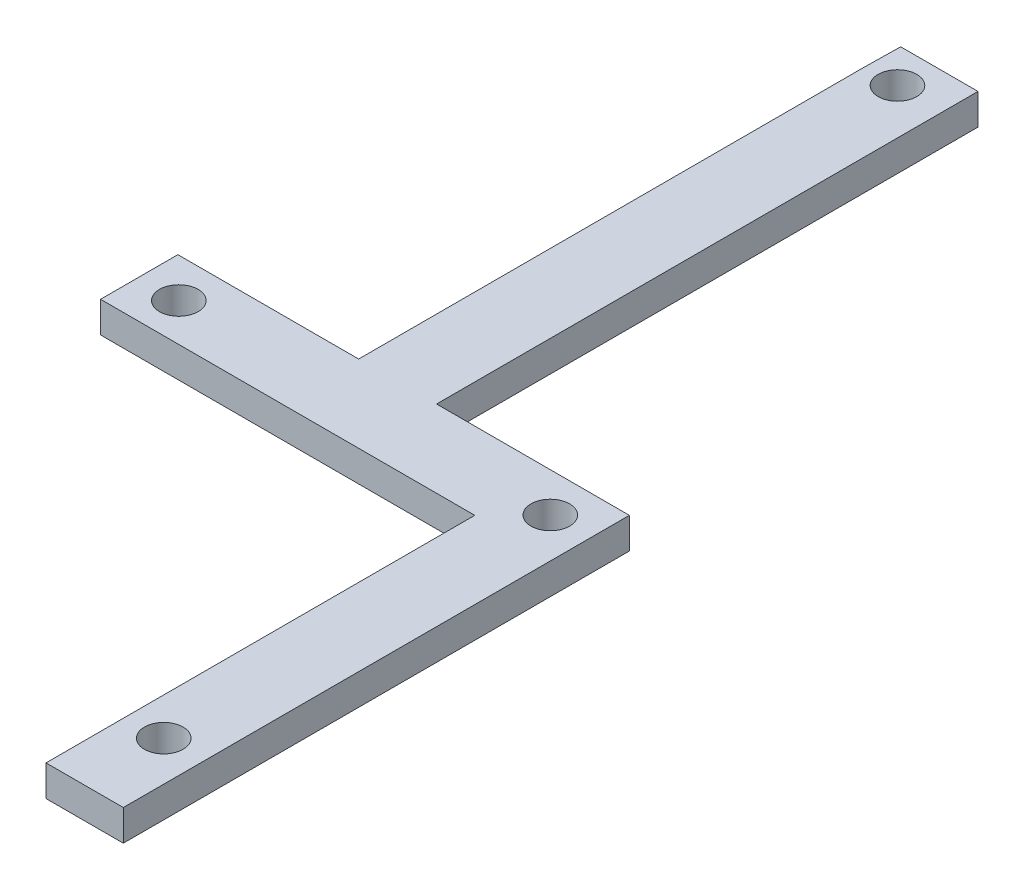
ISO-10303-21;
HEADER;
FILE_DESCRIPTION(('STEP AP214'),'2;1');
FILE_NAME('part.step','',(''),(''),'','','');
FILE_SCHEMA(('AUTOMOTIVE_DESIGN { 1 0 10303 214 1 1 1 1 }'));
ENDSEC;
DATA;
#1=APPLICATION_CONTEXT('core data for automotive mechanical design processes');
#2=APPLICATION_PROTOCOL_DEFINITION('international standard','automotive_design',2000,#1);
#3=PRODUCT_CONTEXT('',#1,'mechanical');
#4=PRODUCT('Part','Part','',(#3));
#5=PRODUCT_RELATED_PRODUCT_CATEGORY('part','',(#4));
#6=PRODUCT_DEFINITION_FORMATION('','',#4);
#7=PRODUCT_DEFINITION_CONTEXT('part definition',#1,'design');
#8=PRODUCT_DEFINITION('design','',#6,#7);
#9=PRODUCT_DEFINITION_SHAPE('','',#8);
#10=(LENGTH_UNIT() NAMED_UNIT(*) SI_UNIT(.MILLI.,.METRE.));
#11=(NAMED_UNIT(*) PLANE_ANGLE_UNIT() SI_UNIT($,.RADIAN.));
#12=(NAMED_UNIT(*) SI_UNIT($,.STERADIAN.) SOLID_ANGLE_UNIT());
#13=UNCERTAINTY_MEASURE_WITH_UNIT(LENGTH_MEASURE(1.E-05),#10,'distance_accuracy_value','');
#14=(GEOMETRIC_REPRESENTATION_CONTEXT(3) GLOBAL_UNCERTAINTY_ASSIGNED_CONTEXT((#13)) GLOBAL_UNIT_ASSIGNED_CONTEXT((#10,
#11,#12)) REPRESENTATION_CONTEXT('',''));
#15=CARTESIAN_POINT('',(0.,0.,0.));
#16=DIRECTION('',(0.,0.,1.));
#17=DIRECTION('',(1.,0.,0.));
#18=AXIS2_PLACEMENT_3D('',#15,#16,#17);
#19=CARTESIAN_POINT('',(3.36246655708464,2.,-2.07431627350034));
#20=DIRECTION('',(0.,0.,-1.));
#21=DIRECTION('',(-1.,0.,0.));
#22=AXIS2_PLACEMENT_3D('',#19,#20,#21);
#23=PLANE('',#22);
#24=DIRECTION('',(1.,0.,0.));
#25=VECTOR('',#24,1.);
#26=CARTESIAN_POINT('',(3.36246655708464,0.,-2.07431627350034));
#27=LINE('',#26,#25);
#28=CARTESIAN_POINT('',(3.36246655708464,0.,-2.07431627350034));
#29=VERTEX_POINT('',#28);
#30=CARTESIAN_POINT('',(27.5653854251472,0.,-2.07431627350034));
#31=VERTEX_POINT('',#30);
#32=EDGE_CURVE('E157',#29,#31,#27,.T.);
#33=ORIENTED_EDGE('',*,*,#32,.T.);
#34=DIRECTION('',(0.,-1.,0.));
#35=VECTOR('',#34,1.);
#36=CARTESIAN_POINT('',(27.5653854251472,2.,-2.07431627350034));
#37=LINE('',#36,#35);
#38=CARTESIAN_POINT('',(27.5653854251472,2.,-2.07431627350034));
#39=VERTEX_POINT('',#38);
#40=EDGE_CURVE('E11',#39,#31,#37,.T.);
#41=ORIENTED_EDGE('',*,*,#40,.F.);
#42=DIRECTION('',(1.,0.,0.));
#43=VECTOR('',#42,1.);
#44=CARTESIAN_POINT('',(3.36246655708464,2.,-2.07431627350034));
#45=LINE('',#44,#43);
#46=CARTESIAN_POINT('',(3.36246655708464,2.,-2.07431627350034));
#47=VERTEX_POINT('',#46);
#48=EDGE_CURVE('E190',#47,#39,#45,.T.);
#49=ORIENTED_EDGE('',*,*,#48,.F.);
#50=DIRECTION('',(0.,-1.,0.));
#51=VECTOR('',#50,1.);
#52=CARTESIAN_POINT('',(3.36246655708464,2.,-2.07431627350034));
#53=LINE('',#52,#51);
#54=EDGE_CURVE('E153',#47,#29,#53,.T.);
#55=ORIENTED_EDGE('',*,*,#54,.T.);
#56=EDGE_LOOP('',(#33,#41,#49,#55));
#57=FACE_BOUND('',#56,.T.);
#58=ADVANCED_FACE('F39',(#57),#23,.F.);
#59=CARTESIAN_POINT('',(27.5653854251472,2.,-2.07431627350034));
#60=DIRECTION('',(1.,0.,0.));
#61=DIRECTION('',(0.,0.,-1.));
#62=AXIS2_PLACEMENT_3D('',#59,#60,#61);
#63=PLANE('',#62);
#64=DIRECTION('',(0.,0.,1.));
#65=VECTOR('',#64,1.);
#66=CARTESIAN_POINT('',(27.5653854251472,0.,-2.07431627350034));
#67=LINE('',#66,#65);
#68=CARTESIAN_POINT('',(27.5653854251472,0.,25.6572654948525));
#69=VERTEX_POINT('',#68);
#70=EDGE_CURVE('E161',#31,#69,#67,.T.);
#71=ORIENTED_EDGE('',*,*,#70,.T.);
#72=DIRECTION('',(0.,-1.,0.));
#73=VECTOR('',#72,1.);
#74=CARTESIAN_POINT('',(27.5653854251472,2.,25.6572654948525));
#75=LINE('',#74,#73);
#76=CARTESIAN_POINT('',(27.5653854251472,2.,25.6572654948525));
#77=VERTEX_POINT('',#76);
#78=EDGE_CURVE('E48',#77,#69,#75,.T.);
#79=ORIENTED_EDGE('',*,*,#78,.F.);
#80=DIRECTION('',(0.,0.,1.));
#81=VECTOR('',#80,1.);
#82=CARTESIAN_POINT('',(27.5653854251472,2.,-2.07431627350034));
#83=LINE('',#82,#81);
#84=EDGE_CURVE('E108',#39,#77,#83,.T.);
#85=ORIENTED_EDGE('',*,*,#84,.F.);
#86=ORIENTED_EDGE('',*,*,#40,.T.);
#87=EDGE_LOOP('',(#71,#79,#85,#86));
#88=FACE_BOUND('',#87,.T.);
#89=ADVANCED_FACE('F277',(#88),#63,.F.);
#90=CARTESIAN_POINT('',(27.5653854251472,2.,25.6572654948525));
#91=DIRECTION('',(0.,0.,-1.));
#92=DIRECTION('',(-1.,0.,0.));
#93=AXIS2_PLACEMENT_3D('',#90,#91,#92);
#94=PLANE('',#93);
#95=DIRECTION('',(1.,0.,0.));
#96=VECTOR('',#95,1.);
#97=CARTESIAN_POINT('',(27.5653854251472,0.,25.6572654948525));
#98=LINE('',#97,#96);
#99=CARTESIAN_POINT('',(32.5653854251472,0.,25.6572654948525));
#100=VERTEX_POINT('',#99);
#101=EDGE_CURVE('E165',#69,#100,#98,.T.);
#102=ORIENTED_EDGE('',*,*,#101,.T.);
#103=DIRECTION('',(0.,-1.,0.));
#104=VECTOR('',#103,1.);
#105=CARTESIAN_POINT('',(32.5653854251472,2.,25.6572654948525));
#106=LINE('',#105,#104);
#107=CARTESIAN_POINT('',(32.5653854251472,2.,25.6572654948525));
#108=VERTEX_POINT('',#107);
#109=EDGE_CURVE('E213',#108,#100,#106,.T.);
#110=ORIENTED_EDGE('',*,*,#109,.F.);
#111=DIRECTION('',(1.,0.,0.));
#112=VECTOR('',#111,1.);
#113=CARTESIAN_POINT('',(27.5653854251472,2.,25.6572654948525));
#114=LINE('',#113,#112);
#115=EDGE_CURVE('E223',#77,#108,#114,.T.);
#116=ORIENTED_EDGE('',*,*,#115,.F.);
#117=ORIENTED_EDGE('',*,*,#78,.T.);
#118=EDGE_LOOP('',(#102,#110,#116,#117));
#119=FACE_BOUND('',#118,.T.);
#120=ADVANCED_FACE('F221',(#119),#94,.F.);
#121=CARTESIAN_POINT('',(32.5653854251472,2.,25.6572654948525));
#122=DIRECTION('',(-1.,0.,0.));
#123=DIRECTION('',(0.,0.,1.));
#124=AXIS2_PLACEMENT_3D('',#121,#122,#123);
#125=PLANE('',#124);
#126=DIRECTION('',(0.,0.,-1.));
#127=VECTOR('',#126,1.);
#128=CARTESIAN_POINT('',(32.5653854251472,0.,25.6572654948525));
#129=LINE('',#128,#127);
#130=CARTESIAN_POINT('',(32.5653854251472,0.,-7.07431627350035));
#131=VERTEX_POINT('',#130);
#132=EDGE_CURVE('E168',#100,#131,#129,.T.);
#133=ORIENTED_EDGE('',*,*,#132,.T.);
#134=DIRECTION('',(0.,-1.,0.));
#135=VECTOR('',#134,1.);
#136=CARTESIAN_POINT('',(32.5653854251472,2.,-7.07431627350035));
#137=LINE('',#136,#135);
#138=CARTESIAN_POINT('',(32.5653854251472,2.,-7.07431627350035));
#139=VERTEX_POINT('',#138);
#140=EDGE_CURVE('E209',#139,#131,#137,.T.);
#141=ORIENTED_EDGE('',*,*,#140,.F.);
#142=DIRECTION('',(0.,0.,-1.));
#143=VECTOR('',#142,1.);
#144=CARTESIAN_POINT('',(32.5653854251472,2.,25.6572654948525));
#145=LINE('',#144,#143);
#146=EDGE_CURVE('E242',#108,#139,#145,.T.);
#147=ORIENTED_EDGE('',*,*,#146,.F.);
#148=ORIENTED_EDGE('',*,*,#109,.T.);
#149=EDGE_LOOP('',(#133,#141,#147,#148));
#150=FACE_BOUND('',#149,.T.);
#151=ADVANCED_FACE('F232',(#150),#125,.F.);
#152=CARTESIAN_POINT('',(32.5653854251472,2.,-7.07431627350035));
#153=DIRECTION('',(0.,0.,1.));
#154=DIRECTION('',(1.,0.,0.));
#155=AXIS2_PLACEMENT_3D('',#152,#153,#154);
#156=PLANE('',#155);
#157=DIRECTION('',(-1.,0.,0.));
#158=VECTOR('',#157,1.);
#159=CARTESIAN_POINT('',(32.5653854251472,0.,-7.07431627350035));
#160=LINE('',#159,#158);
#161=CARTESIAN_POINT('',(20.0947999918388,0.,-7.07431627350035));
#162=VERTEX_POINT('',#161);
#163=EDGE_CURVE('E171',#131,#162,#160,.T.);
#164=ORIENTED_EDGE('',*,*,#163,.T.);
#165=DIRECTION('',(0.,-1.,0.));
#166=VECTOR('',#165,1.);
#167=CARTESIAN_POINT('',(20.0947999918388,2.,-7.07431627350035));
#168=LINE('',#167,#166);
#169=CARTESIAN_POINT('',(20.0947999918388,2.,-7.07431627350035));
#170=VERTEX_POINT('',#169);
#171=EDGE_CURVE('E205',#170,#162,#168,.T.);
#172=ORIENTED_EDGE('',*,*,#171,.F.);
#173=DIRECTION('',(-1.,0.,0.));
#174=VECTOR('',#173,1.);
#175=CARTESIAN_POINT('',(32.5653854251472,2.,-7.07431627350035));
#176=LINE('',#175,#174);
#177=EDGE_CURVE('E238',#139,#170,#176,.T.);
#178=ORIENTED_EDGE('',*,*,#177,.F.);
#179=ORIENTED_EDGE('',*,*,#140,.T.);
#180=EDGE_LOOP('',(#164,#172,#178,#179));
#181=FACE_BOUND('',#180,.T.);
#182=ADVANCED_FACE('F236',(#181),#156,.F.);
#183=CARTESIAN_POINT('',(20.0947999918388,2.,-7.07431627350035));
#184=DIRECTION('',(-1.,0.,0.));
#185=DIRECTION('',(0.,0.,1.));
#186=AXIS2_PLACEMENT_3D('',#183,#184,#185);
#187=PLANE('',#186);
#188=DIRECTION('',(0.,0.,-1.));
#189=VECTOR('',#188,1.);
#190=CARTESIAN_POINT('',(20.0947999918388,0.,-7.07431627350035));
#191=LINE('',#190,#189);
#192=CARTESIAN_POINT('',(20.0947999918388,0.,-42.0922483664968));
#193=VERTEX_POINT('',#192);
#194=EDGE_CURVE('E174',#162,#193,#191,.T.);
#195=ORIENTED_EDGE('',*,*,#194,.T.);
#196=DIRECTION('',(0.,-1.,0.));
#197=VECTOR('',#196,1.);
#198=CARTESIAN_POINT('',(20.0947999918388,2.,-42.0922483664968));
#199=LINE('',#198,#197);
#200=CARTESIAN_POINT('',(20.0947999918388,2.,-42.0922483664968));
#201=VERTEX_POINT('',#200);
#202=EDGE_CURVE('E201',#201,#193,#199,.T.);
#203=ORIENTED_EDGE('',*,*,#202,.F.);
#204=DIRECTION('',(0.,0.,-1.));
#205=VECTOR('',#204,1.);
#206=CARTESIAN_POINT('',(20.0947999918388,2.,-7.07431627350035));
#207=LINE('',#206,#205);
#208=EDGE_CURVE('E241',#170,#201,#207,.T.);
#209=ORIENTED_EDGE('',*,*,#208,.F.);
#210=ORIENTED_EDGE('',*,*,#171,.T.);
#211=EDGE_LOOP('',(#195,#203,#209,#210));
#212=FACE_BOUND('',#211,.T.);
#213=ADVANCED_FACE('F290',(#212),#187,.F.);
#214=CARTESIAN_POINT('',(20.0947999918388,2.,-42.0922483664968));
#215=DIRECTION('',(0.,0.,1.));
#216=DIRECTION('',(1.,0.,0.));
#217=AXIS2_PLACEMENT_3D('',#214,#215,#216);
#218=PLANE('',#217);
#219=DIRECTION('',(-1.,0.,0.));
#220=VECTOR('',#219,1.);
#221=CARTESIAN_POINT('',(20.0947999918388,0.,-42.0922483664968));
#222=LINE('',#221,#220);
#223=CARTESIAN_POINT('',(15.0947999918388,0.,-42.0922483664968));
#224=VERTEX_POINT('',#223);
#225=EDGE_CURVE('E177',#193,#224,#222,.T.);
#226=ORIENTED_EDGE('',*,*,#225,.T.);
#227=DIRECTION('',(0.,-1.,0.));
#228=VECTOR('',#227,1.);
#229=CARTESIAN_POINT('',(15.0947999918388,2.,-42.0922483664968));
#230=LINE('',#229,#228);
#231=CARTESIAN_POINT('',(15.0947999918388,2.,-42.0922483664968));
#232=VERTEX_POINT('',#231);
#233=EDGE_CURVE('E197',#232,#224,#230,.T.);
#234=ORIENTED_EDGE('',*,*,#233,.F.);
#235=DIRECTION('',(-1.,0.,0.));
#236=VECTOR('',#235,1.);
#237=CARTESIAN_POINT('',(20.0947999918388,2.,-42.0922483664968));
#238=LINE('',#237,#236);
#239=EDGE_CURVE('E246',#201,#232,#238,.T.);
#240=ORIENTED_EDGE('',*,*,#239,.F.);
#241=ORIENTED_EDGE('',*,*,#202,.T.);
#242=EDGE_LOOP('',(#226,#234,#240,#241));
#243=FACE_BOUND('',#242,.T.);
#244=ADVANCED_FACE('F257',(#243),#218,.F.);
#245=CARTESIAN_POINT('',(15.0947999918388,2.,-42.0922483664968));
#246=DIRECTION('',(0.999868133574607,0.,0.0162393183979964));
#247=DIRECTION('',(0.0162393183979964,0.,-0.999868133574607));
#248=AXIS2_PLACEMENT_3D('',#245,#246,#247);
#249=PLANE('',#248);
#250=DIRECTION('',(-0.0162393183979964,0.,0.999868133574607));
#251=VECTOR('',#250,1.);
#252=CARTESIAN_POINT('',(15.0947999918388,0.,-42.0922483664968));
#253=LINE('',#252,#251);
#254=CARTESIAN_POINT('',(15.0560239070973,0.,-39.7047730718022));
#255=VERTEX_POINT('',#254);
#256=EDGE_CURVE('E180',#224,#255,#253,.T.);
#257=ORIENTED_EDGE('',*,*,#256,.T.);
#258=DIRECTION('',(0.,-1.,0.));
#259=VECTOR('',#258,1.);
#260=CARTESIAN_POINT('',(15.0560239070973,2.,-39.7047730718022));
#261=LINE('',#260,#259);
#262=CARTESIAN_POINT('',(15.0560239070973,2.,-39.7047730718022));
#263=VERTEX_POINT('',#262);
#264=EDGE_CURVE('E146',#263,#255,#261,.T.);
#265=ORIENTED_EDGE('',*,*,#264,.F.);
#266=DIRECTION('',(-0.0162393183979964,0.,0.999868133574607));
#267=VECTOR('',#266,1.);
#268=CARTESIAN_POINT('',(15.0947999918388,2.,-42.0922483664968));
#269=LINE('',#268,#267);
#270=EDGE_CURVE('E136',#232,#263,#269,.T.);
#271=ORIENTED_EDGE('',*,*,#270,.F.);
#272=ORIENTED_EDGE('',*,*,#233,.T.);
#273=EDGE_LOOP('',(#257,#265,#271,#272));
#274=FACE_BOUND('',#273,.T.);
#275=ADVANCED_FACE('F261',(#274),#249,.F.);
#276=CARTESIAN_POINT('',(15.0560239070973,2.,-26.1681876837931));
#277=DIRECTION('',(1.,0.,0.));
#278=DIRECTION('',(0.,0.,-1.));
#279=AXIS2_PLACEMENT_3D('',#276,#277,#278);
#280=PLANE('',#279);
#281=DIRECTION('',(0.,0.,1.));
#282=VECTOR('',#281,1.);
#283=CARTESIAN_POINT('',(15.0560239070973,0.,-26.1681876837931));
#284=LINE('',#283,#282);
#285=CARTESIAN_POINT('',(15.0560239070973,0.,-7.07431627350035));
#286=VERTEX_POINT('',#285);
#287=EDGE_CURVE('E144',#255,#286,#284,.T.);
#288=ORIENTED_EDGE('',*,*,#287,.T.);
#289=DIRECTION('',(0.,-1.,0.));
#290=VECTOR('',#289,1.);
#291=CARTESIAN_POINT('',(15.0560239070973,2.,-7.07431627350035));
#292=LINE('',#291,#290);
#293=CARTESIAN_POINT('',(15.0560239070973,2.,-7.07431627350035));
#294=VERTEX_POINT('',#293);
#295=EDGE_CURVE('E142',#294,#286,#292,.T.);
#296=ORIENTED_EDGE('',*,*,#295,.F.);
#297=DIRECTION('',(0.,0.,1.));
#298=VECTOR('',#297,1.);
#299=CARTESIAN_POINT('',(15.0560239070973,2.,-39.7047730718022));
#300=LINE('',#299,#298);
#301=EDGE_CURVE('E130',#263,#294,#300,.T.);
#302=ORIENTED_EDGE('',*,*,#301,.F.);
#303=ORIENTED_EDGE('',*,*,#264,.T.);
#304=EDGE_LOOP('',(#288,#296,#302,#303));
#305=FACE_BOUND('',#304,.T.);
#306=ADVANCED_FACE('F143',(#305),#280,.F.);
#307=CARTESIAN_POINT('',(15.0560239070973,2.,-7.07431627350035));
#308=DIRECTION('',(0.,0.,1.));
#309=DIRECTION('',(1.,0.,0.));
#310=AXIS2_PLACEMENT_3D('',#307,#308,#309);
#311=PLANE('',#310);
#312=DIRECTION('',(-1.,0.,0.));
#313=VECTOR('',#312,1.);
#314=CARTESIAN_POINT('',(15.0560239070973,0.,-7.07431627350035));
#315=LINE('',#314,#313);
#316=CARTESIAN_POINT('',(3.36246655708464,0.,-7.07431627350034));
#317=VERTEX_POINT('',#316);
#318=EDGE_CURVE('E94',#286,#317,#315,.T.);
#319=ORIENTED_EDGE('',*,*,#318,.T.);
#320=DIRECTION('',(0.,-1.,0.));
#321=VECTOR('',#320,1.);
#322=CARTESIAN_POINT('',(3.36246655708464,2.,-7.07431627350034));
#323=LINE('',#322,#321);
#324=CARTESIAN_POINT('',(3.36246655708464,2.,-7.07431627350034));
#325=VERTEX_POINT('',#324);
#326=EDGE_CURVE('E147',#325,#317,#323,.T.);
#327=ORIENTED_EDGE('',*,*,#326,.F.);
#328=DIRECTION('',(-1.,0.,0.));
#329=VECTOR('',#328,1.);
#330=CARTESIAN_POINT('',(15.0560239070973,2.,-7.07431627350035));
#331=LINE('',#330,#329);
#332=EDGE_CURVE('E134',#294,#325,#331,.T.);
#333=ORIENTED_EDGE('',*,*,#332,.F.);
#334=ORIENTED_EDGE('',*,*,#295,.T.);
#335=EDGE_LOOP('',(#319,#327,#333,#334));
#336=FACE_BOUND('',#335,.T.);
#337=ADVANCED_FACE('F149',(#336),#311,.F.);
#338=CARTESIAN_POINT('',(3.36246655708464,2.,-7.07431627350034));
#339=DIRECTION('',(1.,0.,0.));
#340=DIRECTION('',(0.,0.,-1.));
#341=AXIS2_PLACEMENT_3D('',#338,#339,#340);
#342=PLANE('',#341);
#343=DIRECTION('',(0.,0.,1.));
#344=VECTOR('',#343,1.);
#345=CARTESIAN_POINT('',(3.36246655708464,0.,-7.07431627350034));
#346=LINE('',#345,#344);
#347=EDGE_CURVE('E100',#317,#29,#346,.T.);
#348=ORIENTED_EDGE('',*,*,#347,.T.);
#349=ORIENTED_EDGE('',*,*,#54,.F.);
#350=DIRECTION('',(0.,0.,1.));
#351=VECTOR('',#350,1.);
#352=CARTESIAN_POINT('',(3.36246655708464,2.,-7.07431627350034));
#353=LINE('',#352,#351);
#354=EDGE_CURVE('E56',#325,#47,#353,.T.);
#355=ORIENTED_EDGE('',*,*,#354,.F.);
#356=ORIENTED_EDGE('',*,*,#326,.T.);
#357=EDGE_LOOP('',(#348,#349,#355,#356));
#358=FACE_BOUND('',#357,.T.);
#359=ADVANCED_FACE('F265',(#358),#342,.F.);
#360=CARTESIAN_POINT('',(0.,2.,0.));
#361=DIRECTION('',(0.,-1.,0.));
#362=DIRECTION('',(0.,0.,-1.));
#363=AXIS2_PLACEMENT_3D('',#360,#361,#362);
#364=PLANE('',#363);
#365=CARTESIAN_POINT('',(17.1586532714971,2.,-39.8197879478269));
#366=DIRECTION('',(0.,1.,0.));
#367=DIRECTION('',(0.,0.,1.));
#368=AXIS2_PLACEMENT_3D('',#365,#366,#367);
#369=CIRCLE('',#368,1.25);
#370=CARTESIAN_POINT('',(17.1586532714971,2.,-38.5697879478269));
#371=VERTEX_POINT('',#370);
#372=EDGE_CURVE('E374',#371,#371,#369,.T.);
#373=ORIENTED_EDGE('',*,*,#372,.F.);
#374=EDGE_LOOP('',(#373));
#375=FACE_BOUND('',#374,.T.);
#376=CARTESIAN_POINT('',(5.9622637612266,2.,-4.53578794782702));
#377=DIRECTION('',(0.,1.,0.));
#378=DIRECTION('',(0.,0.,1.));
#379=AXIS2_PLACEMENT_3D('',#376,#377,#378);
#380=CIRCLE('',#379,1.25);
#381=CARTESIAN_POINT('',(5.9622637612266,2.,-3.28578794782702));
#382=VERTEX_POINT('',#381);
#383=EDGE_CURVE('E382',#382,#382,#380,.T.);
#384=ORIENTED_EDGE('',*,*,#383,.F.);
#385=EDGE_LOOP('',(#384));
#386=FACE_BOUND('',#385,.T.);
#387=CARTESIAN_POINT('',(29.9886532714963,2.,-4.53578794782702));
#388=DIRECTION('',(0.,1.,0.));
#389=DIRECTION('',(0.,0.,1.));
#390=AXIS2_PLACEMENT_3D('',#387,#388,#389);
#391=CIRCLE('',#390,1.25);
#392=CARTESIAN_POINT('',(29.9886532714963,2.,-3.28578794782702));
#393=VERTEX_POINT('',#392);
#394=EDGE_CURVE('E392',#393,#393,#391,.T.);
#395=ORIENTED_EDGE('',*,*,#394,.F.);
#396=EDGE_LOOP('',(#395));
#397=FACE_BOUND('',#396,.T.);
#398=CARTESIAN_POINT('',(29.9886532714963,2.,20.4663095498579));
#399=DIRECTION('',(0.,1.,0.));
#400=DIRECTION('',(0.,0.,1.));
#401=AXIS2_PLACEMENT_3D('',#398,#399,#400);
#402=CIRCLE('',#401,1.25);
#403=CARTESIAN_POINT('',(29.9886532714963,2.,21.7163095498579));
#404=VERTEX_POINT('',#403);
#405=EDGE_CURVE('E400',#404,#404,#402,.T.);
#406=ORIENTED_EDGE('',*,*,#405,.F.);
#407=EDGE_LOOP('',(#406));
#408=FACE_BOUND('',#407,.T.);
#409=ORIENTED_EDGE('',*,*,#48,.T.);
#410=ORIENTED_EDGE('',*,*,#84,.T.);
#411=ORIENTED_EDGE('',*,*,#115,.T.);
#412=ORIENTED_EDGE('',*,*,#146,.T.);
#413=ORIENTED_EDGE('',*,*,#177,.T.);
#414=ORIENTED_EDGE('',*,*,#208,.T.);
#415=ORIENTED_EDGE('',*,*,#239,.T.);
#416=ORIENTED_EDGE('',*,*,#270,.T.);
#417=ORIENTED_EDGE('',*,*,#301,.T.);
#418=ORIENTED_EDGE('',*,*,#332,.T.);
#419=ORIENTED_EDGE('',*,*,#354,.T.);
#420=EDGE_LOOP('',(#409,#410,#411,#412,#413,#414,#415,#416,#417,#418,#419));
#421=FACE_BOUND('',#420,.T.);
#422=ADVANCED_FACE('F132',(#375,#386,#397,#408,#421),#364,.F.);
#423=CARTESIAN_POINT('',(0.,0.,0.));
#424=DIRECTION('',(0.,-1.,0.));
#425=DIRECTION('',(0.,0.,-1.));
#426=AXIS2_PLACEMENT_3D('',#423,#424,#425);
#427=PLANE('',#426);
#428=CARTESIAN_POINT('',(17.1586532714971,0.,-39.8197879478269));
#429=DIRECTION('',(0.,1.,0.));
#430=DIRECTION('',(0.,0.,1.));
#431=AXIS2_PLACEMENT_3D('',#428,#429,#430);
#432=CIRCLE('',#431,1.25);
#433=CARTESIAN_POINT('',(17.1586532714971,0.,-38.5697879478269));
#434=VERTEX_POINT('',#433);
#435=EDGE_CURVE('E162',#434,#434,#432,.T.);
#436=ORIENTED_EDGE('',*,*,#435,.T.);
#437=EDGE_LOOP('',(#436));
#438=FACE_BOUND('',#437,.T.);
#439=CARTESIAN_POINT('',(5.9622637612266,0.,-4.53578794782702));
#440=DIRECTION('',(0.,1.,0.));
#441=DIRECTION('',(0.,0.,1.));
#442=AXIS2_PLACEMENT_3D('',#439,#440,#441);
#443=CIRCLE('',#442,1.25);
#444=CARTESIAN_POINT('',(5.9622637612266,0.,-3.28578794782702));
#445=VERTEX_POINT('',#444);
#446=EDGE_CURVE('E376',#445,#445,#443,.T.);
#447=ORIENTED_EDGE('',*,*,#446,.T.);
#448=EDGE_LOOP('',(#447));
#449=FACE_BOUND('',#448,.T.);
#450=CARTESIAN_POINT('',(29.9886532714963,0.,-4.53578794782702));
#451=DIRECTION('',(0.,1.,0.));
#452=DIRECTION('',(0.,0.,1.));
#453=AXIS2_PLACEMENT_3D('',#450,#451,#452);
#454=CIRCLE('',#453,1.25);
#455=CARTESIAN_POINT('',(29.9886532714963,0.,-3.28578794782702));
#456=VERTEX_POINT('',#455);
#457=EDGE_CURVE('E388',#456,#456,#454,.T.);
#458=ORIENTED_EDGE('',*,*,#457,.T.);
#459=EDGE_LOOP('',(#458));
#460=FACE_BOUND('',#459,.T.);
#461=CARTESIAN_POINT('',(29.9886532714963,0.,20.4663095498579));
#462=DIRECTION('',(0.,1.,0.));
#463=DIRECTION('',(0.,0.,1.));
#464=AXIS2_PLACEMENT_3D('',#461,#462,#463);
#465=CIRCLE('',#464,1.25);
#466=CARTESIAN_POINT('',(29.9886532714963,0.,21.7163095498579));
#467=VERTEX_POINT('',#466);
#468=EDGE_CURVE('E396',#467,#467,#465,.T.);
#469=ORIENTED_EDGE('',*,*,#468,.T.);
#470=EDGE_LOOP('',(#469));
#471=FACE_BOUND('',#470,.T.);
#472=ORIENTED_EDGE('',*,*,#32,.F.);
#473=ORIENTED_EDGE('',*,*,#347,.F.);
#474=ORIENTED_EDGE('',*,*,#318,.F.);
#475=ORIENTED_EDGE('',*,*,#287,.F.);
#476=ORIENTED_EDGE('',*,*,#256,.F.);
#477=ORIENTED_EDGE('',*,*,#225,.F.);
#478=ORIENTED_EDGE('',*,*,#194,.F.);
#479=ORIENTED_EDGE('',*,*,#163,.F.);
#480=ORIENTED_EDGE('',*,*,#132,.F.);
#481=ORIENTED_EDGE('',*,*,#101,.F.);
#482=ORIENTED_EDGE('',*,*,#70,.F.);
#483=EDGE_LOOP('',(#472,#473,#474,#475,#476,#477,#478,#479,#480,#481,#482));
#484=FACE_BOUND('',#483,.T.);
#485=ADVANCED_FACE('F227',(#438,#449,#460,#471,#484),#427,.T.);
#486=CARTESIAN_POINT('',(29.9886532714963,0.,20.4663095498579));
#487=DIRECTION('',(0.,1.,0.));
#488=DIRECTION('',(0.,0.,1.));
#489=AXIS2_PLACEMENT_3D('',#486,#487,#488);
#490=CYLINDRICAL_SURFACE('',#489,1.25);
#491=ORIENTED_EDGE('',*,*,#468,.F.);
#492=EDGE_LOOP('',(#491));
#493=FACE_BOUND('',#492,.T.);
#494=ORIENTED_EDGE('',*,*,#405,.T.);
#495=EDGE_LOOP('',(#494));
#496=FACE_BOUND('',#495,.T.);
#497=ADVANCED_FACE('F326',(#493,#496),#490,.F.);
#498=CARTESIAN_POINT('',(29.9886532714963,0.,-4.53578794782702));
#499=DIRECTION('',(0.,1.,0.));
#500=DIRECTION('',(0.,0.,1.));
#501=AXIS2_PLACEMENT_3D('',#498,#499,#500);
#502=CYLINDRICAL_SURFACE('',#501,1.25);
#503=ORIENTED_EDGE('',*,*,#457,.F.);
#504=EDGE_LOOP('',(#503));
#505=FACE_BOUND('',#504,.T.);
#506=ORIENTED_EDGE('',*,*,#394,.T.);
#507=EDGE_LOOP('',(#506));
#508=FACE_BOUND('',#507,.T.);
#509=ADVANCED_FACE('F335',(#505,#508),#502,.F.);
#510=CARTESIAN_POINT('',(5.9622637612266,0.,-4.53578794782702));
#511=DIRECTION('',(0.,1.,0.));
#512=DIRECTION('',(0.,0.,1.));
#513=AXIS2_PLACEMENT_3D('',#510,#511,#512);
#514=CYLINDRICAL_SURFACE('',#513,1.25);
#515=ORIENTED_EDGE('',*,*,#446,.F.);
#516=EDGE_LOOP('',(#515));
#517=FACE_BOUND('',#516,.T.);
#518=ORIENTED_EDGE('',*,*,#383,.T.);
#519=EDGE_LOOP('',(#518));
#520=FACE_BOUND('',#519,.T.);
#521=ADVANCED_FACE('F345',(#517,#520),#514,.F.);
#522=CARTESIAN_POINT('',(17.1586532714971,0.,-39.8197879478269));
#523=DIRECTION('',(0.,1.,0.));
#524=DIRECTION('',(0.,0.,1.));
#525=AXIS2_PLACEMENT_3D('',#522,#523,#524);
#526=CYLINDRICAL_SURFACE('',#525,1.25);
#527=ORIENTED_EDGE('',*,*,#435,.F.);
#528=EDGE_LOOP('',(#527));
#529=FACE_BOUND('',#528,.T.);
#530=ORIENTED_EDGE('',*,*,#372,.T.);
#531=EDGE_LOOP('',(#530));
#532=FACE_BOUND('',#531,.T.);
#533=ADVANCED_FACE('F355',(#529,#532),#526,.F.);
#534=CLOSED_SHELL('',(#58,#89,#120,#151,#182,#213,#244,#275,#306,#337,#359,#422,#485,#497,#509,
#521,#533));
#535=MANIFOLD_SOLID_BREP('B2',#534);
#536=ADVANCED_BREP_SHAPE_REPRESENTATION('',(#18,#535),#14);
#537=SHAPE_DEFINITION_REPRESENTATION(#9,#536);
ENDSEC;
END-ISO-10303-21;
